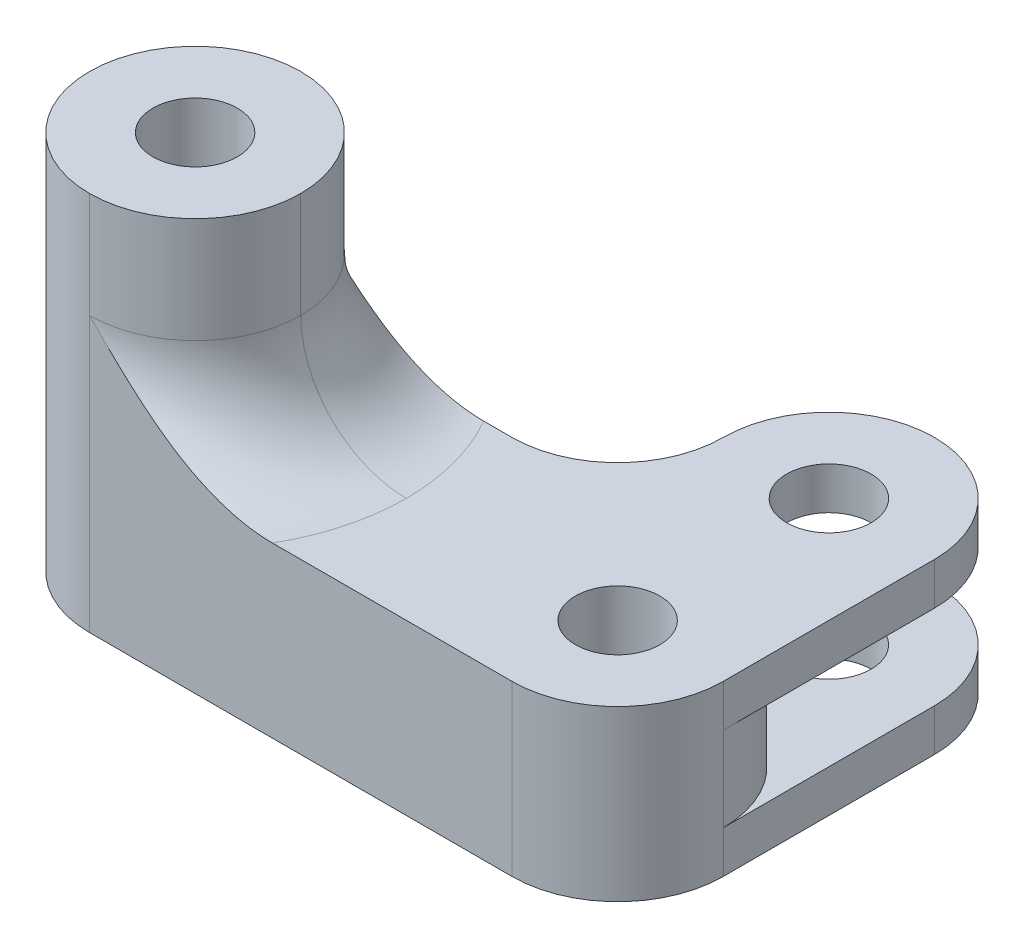
ISO-10303-21;
HEADER;
FILE_DESCRIPTION(('STEP AP214'),'2;1');
FILE_NAME('part.step','',(''),(''),'','','');
FILE_SCHEMA(('AUTOMOTIVE_DESIGN { 1 0 10303 214 1 1 1 1 }'));
ENDSEC;
DATA;
#1=APPLICATION_CONTEXT('core data for automotive mechanical design processes');
#2=APPLICATION_PROTOCOL_DEFINITION('international standard','automotive_design',2000,#1);
#3=PRODUCT_CONTEXT('',#1,'mechanical');
#4=PRODUCT('Part','Part','',(#3));
#5=PRODUCT_RELATED_PRODUCT_CATEGORY('part','',(#4));
#6=PRODUCT_DEFINITION_FORMATION('','',#4);
#7=PRODUCT_DEFINITION_CONTEXT('part definition',#1,'design');
#8=PRODUCT_DEFINITION('design','',#6,#7);
#9=PRODUCT_DEFINITION_SHAPE('','',#8);
#10=(LENGTH_UNIT() NAMED_UNIT(*) SI_UNIT(.MILLI.,.METRE.));
#11=(NAMED_UNIT(*) PLANE_ANGLE_UNIT() SI_UNIT($,.RADIAN.));
#12=(NAMED_UNIT(*) SI_UNIT($,.STERADIAN.) SOLID_ANGLE_UNIT());
#13=UNCERTAINTY_MEASURE_WITH_UNIT(LENGTH_MEASURE(1.E-05),#10,'distance_accuracy_value','');
#14=(GEOMETRIC_REPRESENTATION_CONTEXT(3) GLOBAL_UNCERTAINTY_ASSIGNED_CONTEXT((#13)) GLOBAL_UNIT_ASSIGNED_CONTEXT((#10,
#11,#12)) REPRESENTATION_CONTEXT('',''));
#15=CARTESIAN_POINT('',(0.,0.,0.));
#16=DIRECTION('',(0.,0.,1.));
#17=DIRECTION('',(1.,0.,0.));
#18=AXIS2_PLACEMENT_3D('',#15,#16,#17);
#19=CARTESIAN_POINT('',(-20.,4.,0.));
#20=DIRECTION('',(-1.,0.,0.));
#21=DIRECTION('',(0.,0.,-1.));
#22=AXIS2_PLACEMENT_3D('',#19,#20,#21);
#23=PLANE('',#22);
#24=DIRECTION('',(0.,-1.,0.));
#25=VECTOR('',#24,1.);
#26=CARTESIAN_POINT('',(-20.,4.,-2.5));
#27=LINE('',#26,#25);
#28=CARTESIAN_POINT('',(-20.,0.,-2.5));
#29=VERTEX_POINT('',#28);
#30=CARTESIAN_POINT('',(-20.,1.,-2.5));
#31=VERTEX_POINT('',#30);
#32=EDGE_CURVE('E278',#29,#31,#27,.F.);
#33=ORIENTED_EDGE('',*,*,#32,.F.);
#34=DIRECTION('',(0.,0.,1.));
#35=VECTOR('',#34,1.);
#36=CARTESIAN_POINT('',(-20.,0.,0.));
#37=LINE('',#36,#35);
#38=CARTESIAN_POINT('',(-20.,0.,-7.5));
#39=VERTEX_POINT('',#38);
#40=EDGE_CURVE('E184',#39,#29,#37,.T.);
#41=ORIENTED_EDGE('',*,*,#40,.F.);
#42=DIRECTION('',(0.,-1.,0.));
#43=VECTOR('',#42,1.);
#44=CARTESIAN_POINT('',(-20.,4.,-7.5));
#45=LINE('',#44,#43);
#46=CARTESIAN_POINT('',(-20.,1.,-7.5));
#47=VERTEX_POINT('',#46);
#48=EDGE_CURVE('E267',#47,#39,#45,.T.);
#49=ORIENTED_EDGE('',*,*,#48,.F.);
#50=DIRECTION('',(0.,0.,-1.));
#51=VECTOR('',#50,1.);
#52=CARTESIAN_POINT('',(-20.,1.,-5.));
#53=LINE('',#52,#51);
#54=EDGE_CURVE('E472',#31,#47,#53,.T.);
#55=ORIENTED_EDGE('',*,*,#54,.F.);
#56=EDGE_LOOP('',(#33,#41,#49,#55));
#57=FACE_BOUND('',#56,.T.);
#58=ADVANCED_FACE('F44',(#57),#23,.F.);
#59=CARTESIAN_POINT('',(-22.5,0.,-7.5));
#60=DIRECTION('',(0.,1.,0.));
#61=DIRECTION('',(0.,0.,1.));
#62=AXIS2_PLACEMENT_3D('',#59,#60,#61);
#63=CYLINDRICAL_SURFACE('',#62,1.);
#64=CARTESIAN_POINT('',(-22.5,3.,-7.5));
#65=DIRECTION('',(0.,-1.,0.));
#66=DIRECTION('',(0.,0.,1.));
#67=AXIS2_PLACEMENT_3D('',#64,#65,#66);
#68=CIRCLE('',#67,1.);
#69=CARTESIAN_POINT('',(-22.5,3.,-6.5));
#70=VERTEX_POINT('',#69);
#71=EDGE_CURVE('E228',#70,#70,#68,.F.);
#72=ORIENTED_EDGE('',*,*,#71,.F.);
#73=EDGE_LOOP('',(#72));
#74=FACE_BOUND('',#73,.T.);
#75=CARTESIAN_POINT('',(-22.5,4.,-7.5));
#76=DIRECTION('',(0.,-1.,0.));
#77=DIRECTION('',(0.,0.,1.));
#78=AXIS2_PLACEMENT_3D('',#75,#76,#77);
#79=CIRCLE('',#78,1.);
#80=CARTESIAN_POINT('',(-22.5,4.,-6.5));
#81=VERTEX_POINT('',#80);
#82=EDGE_CURVE('E216',#81,#81,#79,.T.);
#83=ORIENTED_EDGE('',*,*,#82,.F.);
#84=EDGE_LOOP('',(#83));
#85=FACE_BOUND('',#84,.T.);
#86=ADVANCED_FACE('F444',(#74,#85),#63,.F.);
#87=CARTESIAN_POINT('',(-20.,4.,0.));
#88=DIRECTION('',(0.,-1.,0.));
#89=DIRECTION('',(0.,0.,-1.));
#90=AXIS2_PLACEMENT_3D('',#87,#88,#89);
#91=PLANE('',#90);
#92=CARTESIAN_POINT('',(-22.5,4.,-2.5));
#93=DIRECTION('',(0.,-1.,0.));
#94=DIRECTION('',(0.,0.,1.));
#95=AXIS2_PLACEMENT_3D('',#92,#93,#94);
#96=CIRCLE('',#95,1.);
#97=CARTESIAN_POINT('',(-22.5,4.,-1.5));
#98=VERTEX_POINT('',#97);
#99=EDGE_CURVE('E488',#98,#98,#96,.T.);
#100=ORIENTED_EDGE('',*,*,#99,.T.);
#101=EDGE_LOOP('',(#100));
#102=FACE_BOUND('',#101,.T.);
#103=ORIENTED_EDGE('',*,*,#82,.T.);
#104=EDGE_LOOP('',(#103));
#105=FACE_BOUND('',#104,.T.);
#106=DIRECTION('',(-1.,0.,0.));
#107=VECTOR('',#106,1.);
#108=CARTESIAN_POINT('',(-35.,4.,0.));
#109=LINE('',#108,#107);
#110=CARTESIAN_POINT('',(-22.5,4.,0.));
#111=VERTEX_POINT('',#110);
#112=CARTESIAN_POINT('',(-28.1698729810779,4.,0.));
#113=VERTEX_POINT('',#112);
#114=EDGE_CURVE('E223',#111,#113,#109,.T.);
#115=ORIENTED_EDGE('',*,*,#114,.F.);
#116=CARTESIAN_POINT('',(-22.5,4.,-2.5));
#117=DIRECTION('',(0.,1.,0.));
#118=DIRECTION('',(0.,0.,-1.));
#119=AXIS2_PLACEMENT_3D('',#116,#117,#118);
#120=CIRCLE('',#119,2.5);
#121=CARTESIAN_POINT('',(-20.,4.,-2.5));
#122=VERTEX_POINT('',#121);
#123=EDGE_CURVE('E196',#122,#111,#120,.F.);
#124=ORIENTED_EDGE('',*,*,#123,.F.);
#125=DIRECTION('',(0.,0.,1.));
#126=VECTOR('',#125,1.);
#127=CARTESIAN_POINT('',(-20.,4.,0.));
#128=LINE('',#127,#126);
#129=CARTESIAN_POINT('',(-20.,4.,-7.5));
#130=VERTEX_POINT('',#129);
#131=EDGE_CURVE('E202',#130,#122,#128,.T.);
#132=ORIENTED_EDGE('',*,*,#131,.F.);
#133=CARTESIAN_POINT('',(-22.5,4.,-7.5));
#134=DIRECTION('',(0.,1.,0.));
#135=DIRECTION('',(0.,0.,-1.));
#136=AXIS2_PLACEMENT_3D('',#133,#134,#135);
#137=CIRCLE('',#136,2.5);
#138=CARTESIAN_POINT('',(-22.5,4.,-10.));
#139=VERTEX_POINT('',#138);
#140=EDGE_CURVE('E298',#139,#130,#137,.F.);
#141=ORIENTED_EDGE('',*,*,#140,.F.);
#142=CARTESIAN_POINT('',(-22.5,4.,-7.5));
#143=DIRECTION('',(0.,1.,0.));
#144=DIRECTION('',(0.,0.,-1.));
#145=AXIS2_PLACEMENT_3D('',#142,#143,#144);
#146=CIRCLE('',#145,2.5);
#147=CARTESIAN_POINT('',(-25.,4.,-7.5));
#148=VERTEX_POINT('',#147);
#149=EDGE_CURVE('E189',#148,#139,#146,.F.);
#150=ORIENTED_EDGE('',*,*,#149,.F.);
#151=CARTESIAN_POINT('',(-27.5,4.,-7.5));
#152=DIRECTION('',(0.,1.,0.));
#153=DIRECTION('',(0.,0.,-1.));
#154=AXIS2_PLACEMENT_3D('',#151,#152,#153);
#155=CIRCLE('',#154,2.5);
#156=CARTESIAN_POINT('',(-27.5,4.,-5.));
#157=VERTEX_POINT('',#156);
#158=EDGE_CURVE('E336',#157,#148,#155,.T.);
#159=ORIENTED_EDGE('',*,*,#158,.F.);
#160=DIRECTION('',(1.,0.,0.));
#161=VECTOR('',#160,1.);
#162=CARTESIAN_POINT('',(-25.,4.,-5.));
#163=LINE('',#162,#161);
#164=CARTESIAN_POINT('',(-28.1698729810779,4.,-5.));
#165=VERTEX_POINT('',#164);
#166=EDGE_CURVE('E500',#165,#157,#163,.T.);
#167=ORIENTED_EDGE('',*,*,#166,.F.);
#168=CARTESIAN_POINT('',(-32.5000000000001,4.,-2.5));
#169=DIRECTION('',(0.,1.,0.));
#170=DIRECTION('',(0.,0.,-1.));
#171=AXIS2_PLACEMENT_3D('',#168,#169,#170);
#172=CIRCLE('',#171,5.);
#173=CARTESIAN_POINT('',(-27.5000000000001,4.,-2.5));
#174=VERTEX_POINT('',#173);
#175=EDGE_CURVE('E340',#174,#165,#172,.T.);
#176=ORIENTED_EDGE('',*,*,#175,.F.);
#177=CARTESIAN_POINT('',(-32.5000000000001,4.,-2.5));
#178=DIRECTION('',(0.,1.,0.));
#179=DIRECTION('',(0.,0.,-1.));
#180=AXIS2_PLACEMENT_3D('',#177,#178,#179);
#181=CIRCLE('',#180,5.);
#182=EDGE_CURVE('E372',#113,#174,#181,.T.);
#183=ORIENTED_EDGE('',*,*,#182,.F.);
#184=EDGE_LOOP('',(#115,#124,#132,#141,#150,#159,#167,#176,#183));
#185=FACE_BOUND('',#184,.T.);
#186=ADVANCED_FACE('F451',(#102,#105,#185),#91,.F.);
#187=CARTESIAN_POINT('',(-35.,4.,0.));
#188=DIRECTION('',(0.,0.,-1.));
#189=DIRECTION('',(1.,0.,0.));
#190=AXIS2_PLACEMENT_3D('',#187,#188,#189);
#191=PLANE('',#190);
#192=DIRECTION('',(0.,-1.,0.));
#193=VECTOR('',#192,1.);
#194=CARTESIAN_POINT('',(-32.5,4.,0.));
#195=LINE('',#194,#193);
#196=CARTESIAN_POINT('',(-32.5,0.,0.));
#197=VERTEX_POINT('',#196);
#198=CARTESIAN_POINT('',(-32.5,6.5,0.));
#199=VERTEX_POINT('',#198);
#200=EDGE_CURVE('E201',#197,#199,#195,.F.);
#201=ORIENTED_EDGE('',*,*,#200,.F.);
#202=DIRECTION('',(-1.,0.,0.));
#203=VECTOR('',#202,1.);
#204=CARTESIAN_POINT('',(-35.,0.,0.));
#205=LINE('',#204,#203);
#206=CARTESIAN_POINT('',(-22.5,0.,0.));
#207=VERTEX_POINT('',#206);
#208=EDGE_CURVE('E181',#207,#197,#205,.T.);
#209=ORIENTED_EDGE('',*,*,#208,.F.);
#210=DIRECTION('',(0.,-1.,0.));
#211=VECTOR('',#210,1.);
#212=CARTESIAN_POINT('',(-22.5,4.,0.));
#213=LINE('',#212,#211);
#214=EDGE_CURVE('E193',#111,#207,#213,.T.);
#215=ORIENTED_EDGE('',*,*,#214,.F.);
#216=ORIENTED_EDGE('',*,*,#114,.T.);
#217=CARTESIAN_POINT('',(-28.1698729810779,4.,0.));
#218=CARTESIAN_POINT('',(-28.2769921376524,3.99998518822628,0.));
#219=CARTESIAN_POINT('',(-28.3840486962264,4.00516117568163,0.));
#220=CARTESIAN_POINT('',(-28.5970987602378,4.02518383038269,0.));
#221=CARTESIAN_POINT('',(-28.7030936345857,4.04001578081046,0.));
#222=CARTESIAN_POINT('',(-28.9121461196993,4.07841097755199,0.));
#223=CARTESIAN_POINT('',(-29.0152237325047,4.10186688814086,0.));
#224=CARTESIAN_POINT('',(-29.2192513301736,4.15679854268729,0.));
#225=CARTESIAN_POINT('',(-29.3202002736822,4.18827811762926,0.));
#226=CARTESIAN_POINT('',(-29.5565843663964,4.27155881264309,0.));
#227=CARTESIAN_POINT('',(-29.690894775336,4.32656450342293,0.));
#228=CARTESIAN_POINT('',(-29.954133986294,4.44830711980283,0.));
#229=CARTESIAN_POINT('',(-30.0830583811297,4.51505342834353,0.));
#230=CARTESIAN_POINT('',(-30.4625016172661,4.73067190225552,0.));
#231=CARTESIAN_POINT('',(-30.7045392055099,4.89448830853526,0.));
#232=CARTESIAN_POINT('',(-31.2165518580897,5.28416937733513,0.));
#233=CARTESIAN_POINT('',(-31.4819025558838,5.51585571962648,0.));
#234=CARTESIAN_POINT('',(-31.9958369049189,5.99599504758527,0.));
#235=CARTESIAN_POINT('',(-32.2444334034416,6.24443488717616,0.));
#236=CARTESIAN_POINT('',(-32.4952859568564,6.49528595699774,0.));
#237=CARTESIAN_POINT('',(-32.4976429794846,6.49764297964821,0.));
#238=CARTESIAN_POINT('',(-32.5000000000001,6.5,0.));
#239=B_SPLINE_CURVE_WITH_KNOTS('',3,(#217,#218,#219,#220,#221,#222,#223,#224,#225,#226,#227,
#228,#229,#230,#231,#232,#233,#234,#235,#236,#237,#238),.UNSPECIFIED.,.F.,.F.,(4,2,2,2,2,2,2,2,
2,2,4),(0.,0.321140775587337,0.641793237301768,0.958582896209301,1.27552409399564,
1.71024159436257,2.1453081066917,3.0190883706329,4.07417999061932,5.12845312778747,
5.13845312779328),.UNSPECIFIED.);
#240=EDGE_CURVE('E55',#199,#113,#239,.F.);
#241=ORIENTED_EDGE('',*,*,#240,.F.);
#242=EDGE_LOOP('',(#201,#209,#215,#216,#241));
#243=FACE_BOUND('',#242,.T.);
#244=ADVANCED_FACE('F204',(#243),#191,.F.);
#245=CARTESIAN_POINT('',(-25.,4.,-5.));
#246=DIRECTION('',(0.,0.,1.));
#247=DIRECTION('',(-1.,0.,0.));
#248=AXIS2_PLACEMENT_3D('',#245,#246,#247);
#249=PLANE('',#248);
#250=DIRECTION('',(1.,0.,0.));
#251=VECTOR('',#250,1.);
#252=CARTESIAN_POINT('',(-20.,1.,-5.));
#253=LINE('',#252,#251);
#254=CARTESIAN_POINT('',(-27.5,1.,-5.));
#255=VERTEX_POINT('',#254);
#256=CARTESIAN_POINT('',(-22.5,1.,-5.));
#257=VERTEX_POINT('',#256);
#258=EDGE_CURVE('E354',#255,#257,#253,.T.);
#259=ORIENTED_EDGE('',*,*,#258,.F.);
#260=DIRECTION('',(0.,-1.,0.));
#261=VECTOR('',#260,1.);
#262=CARTESIAN_POINT('',(-27.5,1.,-5.));
#263=LINE('',#262,#261);
#264=CARTESIAN_POINT('',(-27.5,0.,-5.));
#265=VERTEX_POINT('',#264);
#266=EDGE_CURVE('E259',#265,#255,#263,.F.);
#267=ORIENTED_EDGE('',*,*,#266,.F.);
#268=DIRECTION('',(1.,0.,0.));
#269=VECTOR('',#268,1.);
#270=CARTESIAN_POINT('',(-25.,0.,-5.));
#271=LINE('',#270,#269);
#272=CARTESIAN_POINT('',(-32.5,0.,-5.));
#273=VERTEX_POINT('',#272);
#274=EDGE_CURVE('E208',#273,#265,#271,.T.);
#275=ORIENTED_EDGE('',*,*,#274,.F.);
#276=DIRECTION('',(0.,-1.,0.));
#277=VECTOR('',#276,1.);
#278=CARTESIAN_POINT('',(-32.5,4.,-5.));
#279=LINE('',#278,#277);
#280=CARTESIAN_POINT('',(-32.5,6.5,-5.));
#281=VERTEX_POINT('',#280);
#282=EDGE_CURVE('E252',#281,#273,#279,.T.);
#283=ORIENTED_EDGE('',*,*,#282,.F.);
#284=CARTESIAN_POINT('',(-28.1698729810779,4.,-5.));
#285=CARTESIAN_POINT('',(-28.2769921376524,3.99998518822628,-5.));
#286=CARTESIAN_POINT('',(-28.3840486962264,4.00516117568163,-5.));
#287=CARTESIAN_POINT('',(-28.5970987602378,4.02518383038269,-5.));
#288=CARTESIAN_POINT('',(-28.7030936345857,4.04001578081046,-5.));
#289=CARTESIAN_POINT('',(-28.9121461196993,4.07841097755199,-5.));
#290=CARTESIAN_POINT('',(-29.0152237325047,4.10186688814086,-5.));
#291=CARTESIAN_POINT('',(-29.2192513301736,4.15679854268729,-5.));
#292=CARTESIAN_POINT('',(-29.3202002736822,4.18827811762926,-5.));
#293=CARTESIAN_POINT('',(-29.5565843663964,4.27155881264309,-5.));
#294=CARTESIAN_POINT('',(-29.690894775336,4.32656450342293,-5.));
#295=CARTESIAN_POINT('',(-29.954133986294,4.44830711980283,-5.));
#296=CARTESIAN_POINT('',(-30.0830583811297,4.51505342834353,-5.));
#297=CARTESIAN_POINT('',(-30.4625016172661,4.73067190225552,-5.));
#298=CARTESIAN_POINT('',(-30.7045392055099,4.89448830853526,-5.));
#299=CARTESIAN_POINT('',(-31.2165518580897,5.28416937733513,-5.));
#300=CARTESIAN_POINT('',(-31.4819025558838,5.51585571962648,-5.));
#301=CARTESIAN_POINT('',(-31.9958369049189,5.99599504758527,-5.));
#302=CARTESIAN_POINT('',(-32.2444334034416,6.24443488717616,-5.));
#303=CARTESIAN_POINT('',(-32.4952859568564,6.49528595699774,-5.));
#304=CARTESIAN_POINT('',(-32.4976429794846,6.49764297964821,-5.));
#305=CARTESIAN_POINT('',(-32.5000000000001,6.5,-5.));
#306=B_SPLINE_CURVE_WITH_KNOTS('',3,(#284,#285,#286,#287,#288,#289,#290,#291,#292,#293,#294,
#295,#296,#297,#298,#299,#300,#301,#302,#303,#304,#305),.UNSPECIFIED.,.F.,.F.,(4,2,2,2,2,2,2,2,
2,2,4),(0.,0.321140775587337,0.641793237301768,0.958582896209301,1.27552409399564,
1.71024159436257,2.1453081066917,3.0190883706329,4.07417999061932,5.12845312778747,
5.13845312779328),.UNSPECIFIED.);
#307=EDGE_CURVE('E11',#165,#281,#306,.T.);
#308=ORIENTED_EDGE('',*,*,#307,.F.);
#309=ORIENTED_EDGE('',*,*,#166,.T.);
#310=DIRECTION('',(0.,-1.,0.));
#311=VECTOR('',#310,1.);
#312=CARTESIAN_POINT('',(-27.5,4.,-5.));
#313=LINE('',#312,#311);
#314=CARTESIAN_POINT('',(-27.5,3.,-5.));
#315=VERTEX_POINT('',#314);
#316=EDGE_CURVE('E256',#315,#157,#313,.F.);
#317=ORIENTED_EDGE('',*,*,#316,.F.);
#318=DIRECTION('',(-1.,0.,0.));
#319=VECTOR('',#318,1.);
#320=CARTESIAN_POINT('',(-20.,3.,-5.));
#321=LINE('',#320,#319);
#322=CARTESIAN_POINT('',(-22.5,3.,-5.));
#323=VERTEX_POINT('',#322);
#324=EDGE_CURVE('E476',#323,#315,#321,.T.);
#325=ORIENTED_EDGE('',*,*,#324,.F.);
#326=DIRECTION('',(0.,1.,0.));
#327=VECTOR('',#326,1.);
#328=CARTESIAN_POINT('',(-22.5,4.,-5.));
#329=LINE('',#328,#327);
#330=EDGE_CURVE('E263',#257,#323,#329,.T.);
#331=ORIENTED_EDGE('',*,*,#330,.F.);
#332=EDGE_LOOP('',(#259,#267,#275,#283,#308,#309,#317,#325,#331));
#333=FACE_BOUND('',#332,.T.);
#334=ADVANCED_FACE('F457',(#333),#249,.F.);
#335=DIRECTION('',(0.,0.,-1.));
#336=VECTOR('',#335,1.);
#337=CARTESIAN_POINT('',(-20.,3.,-5.));
#338=LINE('',#337,#336);
#339=CARTESIAN_POINT('',(-20.,3.,-2.5));
#340=VERTEX_POINT('',#339);
#341=CARTESIAN_POINT('',(-20.,3.,-7.5));
#342=VERTEX_POINT('',#341);
#343=EDGE_CURVE('E229',#340,#342,#338,.T.);
#344=ORIENTED_EDGE('',*,*,#343,.T.);
#345=DIRECTION('',(0.,-1.,0.));
#346=VECTOR('',#345,1.);
#347=CARTESIAN_POINT('',(-20.,4.,-7.5));
#348=LINE('',#347,#346);
#349=EDGE_CURVE('E271',#130,#342,#348,.T.);
#350=ORIENTED_EDGE('',*,*,#349,.F.);
#351=ORIENTED_EDGE('',*,*,#131,.T.);
#352=DIRECTION('',(0.,-1.,0.));
#353=VECTOR('',#352,1.);
#354=CARTESIAN_POINT('',(-20.,4.,-2.5));
#355=LINE('',#354,#353);
#356=EDGE_CURVE('E275',#340,#122,#355,.F.);
#357=ORIENTED_EDGE('',*,*,#356,.F.);
#358=EDGE_LOOP('',(#344,#350,#351,#357));
#359=FACE_BOUND('',#358,.T.);
#360=ADVANCED_FACE('F447',(#359),#23,.F.);
#361=CARTESIAN_POINT('',(-20.,0.,0.));
#362=DIRECTION('',(0.,-1.,0.));
#363=DIRECTION('',(0.,0.,-1.));
#364=AXIS2_PLACEMENT_3D('',#361,#362,#363);
#365=PLANE('',#364);
#366=CARTESIAN_POINT('',(-22.5,0.,-7.5));
#367=DIRECTION('',(0.,-1.,0.));
#368=DIRECTION('',(0.,0.,1.));
#369=AXIS2_PLACEMENT_3D('',#366,#367,#368);
#370=CIRCLE('',#369,1.);
#371=CARTESIAN_POINT('',(-22.5,0.,-6.5));
#372=VERTEX_POINT('',#371);
#373=EDGE_CURVE('E209',#372,#372,#370,.T.);
#374=ORIENTED_EDGE('',*,*,#373,.F.);
#375=EDGE_LOOP('',(#374));
#376=FACE_BOUND('',#375,.T.);
#377=CARTESIAN_POINT('',(-22.5,0.,-2.5));
#378=DIRECTION('',(0.,-1.,0.));
#379=DIRECTION('',(0.,0.,1.));
#380=AXIS2_PLACEMENT_3D('',#377,#378,#379);
#381=CIRCLE('',#380,1.);
#382=CARTESIAN_POINT('',(-22.5,0.,-1.5));
#383=VERTEX_POINT('',#382);
#384=EDGE_CURVE('E492',#383,#383,#381,.T.);
#385=ORIENTED_EDGE('',*,*,#384,.F.);
#386=EDGE_LOOP('',(#385));
#387=FACE_BOUND('',#386,.T.);
#388=CARTESIAN_POINT('',(-32.5,0.,-2.5));
#389=DIRECTION('',(0.,-1.,0.));
#390=DIRECTION('',(0.,0.,1.));
#391=AXIS2_PLACEMENT_3D('',#388,#389,#390);
#392=CIRCLE('',#391,1.);
#393=CARTESIAN_POINT('',(-32.5,0.,-1.5));
#394=VERTEX_POINT('',#393);
#395=EDGE_CURVE('E483',#394,#394,#392,.T.);
#396=ORIENTED_EDGE('',*,*,#395,.F.);
#397=EDGE_LOOP('',(#396));
#398=FACE_BOUND('',#397,.T.);
#399=ORIENTED_EDGE('',*,*,#208,.T.);
#400=CARTESIAN_POINT('',(-32.5,0.,-2.5));
#401=DIRECTION('',(0.,1.,0.));
#402=DIRECTION('',(0.,0.,-1.));
#403=AXIS2_PLACEMENT_3D('',#400,#401,#402);
#404=CIRCLE('',#403,2.5);
#405=CARTESIAN_POINT('',(-35.,0.,-2.5));
#406=VERTEX_POINT('',#405);
#407=EDGE_CURVE('E285',#406,#197,#404,.T.);
#408=ORIENTED_EDGE('',*,*,#407,.F.);
#409=CARTESIAN_POINT('',(-32.5,0.,-2.5));
#410=DIRECTION('',(0.,1.,0.));
#411=DIRECTION('',(0.,0.,-1.));
#412=AXIS2_PLACEMENT_3D('',#409,#410,#411);
#413=CIRCLE('',#412,2.5);
#414=EDGE_CURVE('E281',#273,#406,#413,.T.);
#415=ORIENTED_EDGE('',*,*,#414,.F.);
#416=ORIENTED_EDGE('',*,*,#274,.T.);
#417=CARTESIAN_POINT('',(-27.5,0.,-7.5));
#418=DIRECTION('',(0.,1.,0.));
#419=DIRECTION('',(0.,0.,-1.));
#420=AXIS2_PLACEMENT_3D('',#417,#418,#419);
#421=CIRCLE('',#420,2.5);
#422=CARTESIAN_POINT('',(-25.,0.,-7.5));
#423=VERTEX_POINT('',#422);
#424=EDGE_CURVE('E326',#423,#265,#421,.F.);
#425=ORIENTED_EDGE('',*,*,#424,.F.);
#426=CARTESIAN_POINT('',(-22.5,0.,-7.5));
#427=DIRECTION('',(0.,1.,0.));
#428=DIRECTION('',(0.,0.,-1.));
#429=AXIS2_PLACEMENT_3D('',#426,#427,#428);
#430=CIRCLE('',#429,2.5);
#431=CARTESIAN_POINT('',(-22.5,0.,-10.));
#432=VERTEX_POINT('',#431);
#433=EDGE_CURVE('E288',#432,#423,#430,.T.);
#434=ORIENTED_EDGE('',*,*,#433,.F.);
#435=CARTESIAN_POINT('',(-22.5,0.,-7.5));
#436=DIRECTION('',(0.,1.,0.));
#437=DIRECTION('',(0.,0.,-1.));
#438=AXIS2_PLACEMENT_3D('',#435,#436,#437);
#439=CIRCLE('',#438,2.5);
#440=EDGE_CURVE('E190',#39,#432,#439,.T.);
#441=ORIENTED_EDGE('',*,*,#440,.F.);
#442=ORIENTED_EDGE('',*,*,#40,.T.);
#443=CARTESIAN_POINT('',(-22.5,0.,-2.5));
#444=DIRECTION('',(0.,1.,0.));
#445=DIRECTION('',(0.,0.,-1.));
#446=AXIS2_PLACEMENT_3D('',#443,#444,#445);
#447=CIRCLE('',#446,2.5);
#448=EDGE_CURVE('E176',#207,#29,#447,.T.);
#449=ORIENTED_EDGE('',*,*,#448,.F.);
#450=EDGE_LOOP('',(#399,#408,#415,#416,#425,#434,#441,#442,#449));
#451=FACE_BOUND('',#450,.T.);
#452=ADVANCED_FACE('F178',(#376,#387,#398,#451),#365,.T.);
#453=CARTESIAN_POINT('',(-32.5,0.,-2.5));
#454=DIRECTION('',(0.,1.,0.));
#455=DIRECTION('',(0.,0.,1.));
#456=AXIS2_PLACEMENT_3D('',#453,#454,#455);
#457=CYLINDRICAL_SURFACE('',#456,1.);
#458=ORIENTED_EDGE('',*,*,#395,.T.);
#459=EDGE_LOOP('',(#458));
#460=FACE_BOUND('',#459,.T.);
#461=CARTESIAN_POINT('',(-32.5,9.,-2.5));
#462=DIRECTION('',(0.,-1.,0.));
#463=DIRECTION('',(0.,0.,1.));
#464=AXIS2_PLACEMENT_3D('',#461,#462,#463);
#465=CIRCLE('',#464,1.);
#466=CARTESIAN_POINT('',(-32.5,9.,-1.5));
#467=VERTEX_POINT('',#466);
#468=EDGE_CURVE('E232',#467,#467,#465,.T.);
#469=ORIENTED_EDGE('',*,*,#468,.F.);
#470=EDGE_LOOP('',(#469));
#471=FACE_BOUND('',#470,.T.);
#472=ADVANCED_FACE('F463',(#460,#471),#457,.F.);
#473=CARTESIAN_POINT('',(-22.5,0.,-2.5));
#474=DIRECTION('',(0.,1.,0.));
#475=DIRECTION('',(0.,0.,1.));
#476=AXIS2_PLACEMENT_3D('',#473,#474,#475);
#477=CYLINDRICAL_SURFACE('',#476,1.);
#478=ORIENTED_EDGE('',*,*,#384,.T.);
#479=EDGE_LOOP('',(#478));
#480=FACE_BOUND('',#479,.T.);
#481=ORIENTED_EDGE('',*,*,#99,.F.);
#482=EDGE_LOOP('',(#481));
#483=FACE_BOUND('',#482,.T.);
#484=ADVANCED_FACE('F545',(#480,#483),#477,.F.);
#485=CARTESIAN_POINT('',(-22.5,1.,-7.5));
#486=DIRECTION('',(0.,1.,0.));
#487=DIRECTION('',(0.,0.,-1.));
#488=AXIS2_PLACEMENT_3D('',#485,#486,#487);
#489=CIRCLE('',#488,1.);
#490=CARTESIAN_POINT('',(-22.5,1.,-8.5));
#491=VERTEX_POINT('',#490);
#492=EDGE_CURVE('E224',#491,#491,#489,.F.);
#493=ORIENTED_EDGE('',*,*,#492,.F.);
#494=EDGE_LOOP('',(#493));
#495=FACE_BOUND('',#494,.T.);
#496=ORIENTED_EDGE('',*,*,#373,.T.);
#497=EDGE_LOOP('',(#496));
#498=FACE_BOUND('',#497,.T.);
#499=ADVANCED_FACE('F454',(#495,#498),#63,.F.);
#500=CARTESIAN_POINT('',(-20.,9.,0.));
#501=DIRECTION('',(0.,1.,0.));
#502=DIRECTION('',(0.,0.,1.));
#503=AXIS2_PLACEMENT_3D('',#500,#501,#502);
#504=PLANE('',#503);
#505=CARTESIAN_POINT('',(-32.5000000000001,9.,-2.5));
#506=DIRECTION('',(0.,-1.,0.));
#507=DIRECTION('',(0.,0.,1.));
#508=AXIS2_PLACEMENT_3D('',#505,#506,#507);
#509=CIRCLE('',#508,2.5);
#510=CARTESIAN_POINT('',(-32.5,9.,-5.));
#511=VERTEX_POINT('',#510);
#512=CARTESIAN_POINT('',(-30.0000000000001,9.,-2.5));
#513=VERTEX_POINT('',#512);
#514=EDGE_CURVE('E240',#511,#513,#509,.T.);
#515=ORIENTED_EDGE('',*,*,#514,.F.);
#516=CARTESIAN_POINT('',(-32.5,9.,-2.5));
#517=DIRECTION('',(0.,-1.,0.));
#518=DIRECTION('',(0.,0.,1.));
#519=AXIS2_PLACEMENT_3D('',#516,#517,#518);
#520=CIRCLE('',#519,2.5);
#521=CARTESIAN_POINT('',(-35.,9.,-2.5));
#522=VERTEX_POINT('',#521);
#523=EDGE_CURVE('E236',#522,#511,#520,.T.);
#524=ORIENTED_EDGE('',*,*,#523,.F.);
#525=CARTESIAN_POINT('',(-32.5,9.,-2.5));
#526=DIRECTION('',(0.,-1.,0.));
#527=DIRECTION('',(0.,0.,1.));
#528=AXIS2_PLACEMENT_3D('',#525,#526,#527);
#529=CIRCLE('',#528,2.5);
#530=CARTESIAN_POINT('',(-32.5,9.,0.));
#531=VERTEX_POINT('',#530);
#532=EDGE_CURVE('E244',#531,#522,#529,.T.);
#533=ORIENTED_EDGE('',*,*,#532,.F.);
#534=CARTESIAN_POINT('',(-32.5000000000001,9.,-2.5));
#535=DIRECTION('',(0.,-1.,0.));
#536=DIRECTION('',(0.,0.,1.));
#537=AXIS2_PLACEMENT_3D('',#534,#535,#536);
#538=CIRCLE('',#537,2.5);
#539=EDGE_CURVE('E248',#513,#531,#538,.T.);
#540=ORIENTED_EDGE('',*,*,#539,.F.);
#541=EDGE_LOOP('',(#515,#524,#533,#540));
#542=FACE_BOUND('',#541,.T.);
#543=ORIENTED_EDGE('',*,*,#468,.T.);
#544=EDGE_LOOP('',(#543));
#545=FACE_BOUND('',#544,.T.);
#546=ADVANCED_FACE('F544',(#542,#545),#504,.T.);
#547=CARTESIAN_POINT('',(-20.,3.,-5.));
#548=DIRECTION('',(0.,1.,0.));
#549=DIRECTION('',(0.,0.,1.));
#550=AXIS2_PLACEMENT_3D('',#547,#548,#549);
#551=PLANE('',#550);
#552=ORIENTED_EDGE('',*,*,#343,.F.);
#553=CARTESIAN_POINT('',(-22.5,3.,-2.5));
#554=DIRECTION('',(0.,-1.,0.));
#555=DIRECTION('',(0.,0.,1.));
#556=AXIS2_PLACEMENT_3D('',#553,#554,#555);
#557=CIRCLE('',#556,2.5);
#558=EDGE_CURVE('E319',#323,#340,#557,.T.);
#559=ORIENTED_EDGE('',*,*,#558,.F.);
#560=ORIENTED_EDGE('',*,*,#324,.T.);
#561=CARTESIAN_POINT('',(-27.5,3.,-7.5));
#562=DIRECTION('',(0.,-1.,0.));
#563=DIRECTION('',(0.,0.,1.));
#564=AXIS2_PLACEMENT_3D('',#561,#562,#563);
#565=CIRCLE('',#564,2.5);
#566=CARTESIAN_POINT('',(-25.,3.,-7.5));
#567=VERTEX_POINT('',#566);
#568=EDGE_CURVE('E333',#567,#315,#565,.T.);
#569=ORIENTED_EDGE('',*,*,#568,.F.);
#570=CARTESIAN_POINT('',(-22.5,3.,-7.5));
#571=DIRECTION('',(0.,-1.,0.));
#572=DIRECTION('',(0.,0.,1.));
#573=AXIS2_PLACEMENT_3D('',#570,#571,#572);
#574=CIRCLE('',#573,2.5);
#575=CARTESIAN_POINT('',(-22.5,3.,-10.));
#576=VERTEX_POINT('',#575);
#577=EDGE_CURVE('E304',#576,#567,#574,.F.);
#578=ORIENTED_EDGE('',*,*,#577,.F.);
#579=CARTESIAN_POINT('',(-22.5,3.,-7.5));
#580=DIRECTION('',(0.,-1.,0.));
#581=DIRECTION('',(0.,0.,1.));
#582=AXIS2_PLACEMENT_3D('',#579,#580,#581);
#583=CIRCLE('',#582,2.5);
#584=EDGE_CURVE('E308',#342,#576,#583,.F.);
#585=ORIENTED_EDGE('',*,*,#584,.F.);
#586=EDGE_LOOP('',(#552,#559,#560,#569,#578,#585));
#587=FACE_BOUND('',#586,.T.);
#588=ORIENTED_EDGE('',*,*,#71,.T.);
#589=EDGE_LOOP('',(#588));
#590=FACE_BOUND('',#589,.T.);
#591=ADVANCED_FACE('F527',(#587,#590),#551,.F.);
#592=CARTESIAN_POINT('',(-20.,1.,-5.));
#593=DIRECTION('',(0.,-1.,0.));
#594=DIRECTION('',(0.,0.,-1.));
#595=AXIS2_PLACEMENT_3D('',#592,#593,#594);
#596=PLANE('',#595);
#597=CARTESIAN_POINT('',(-22.5,1.,-7.5));
#598=DIRECTION('',(0.,1.,0.));
#599=DIRECTION('',(0.,0.,-1.));
#600=AXIS2_PLACEMENT_3D('',#597,#598,#599);
#601=CIRCLE('',#600,2.5);
#602=CARTESIAN_POINT('',(-25.,1.,-7.5));
#603=VERTEX_POINT('',#602);
#604=CARTESIAN_POINT('',(-22.5,1.,-10.));
#605=VERTEX_POINT('',#604);
#606=EDGE_CURVE('E312',#603,#605,#601,.F.);
#607=ORIENTED_EDGE('',*,*,#606,.F.);
#608=CARTESIAN_POINT('',(-27.5,1.,-7.5));
#609=DIRECTION('',(0.,1.,0.));
#610=DIRECTION('',(0.,0.,-1.));
#611=AXIS2_PLACEMENT_3D('',#608,#609,#610);
#612=CIRCLE('',#611,2.5);
#613=EDGE_CURVE('E329',#255,#603,#612,.T.);
#614=ORIENTED_EDGE('',*,*,#613,.F.);
#615=ORIENTED_EDGE('',*,*,#258,.T.);
#616=CARTESIAN_POINT('',(-22.5,1.,-2.5));
#617=DIRECTION('',(0.,1.,0.));
#618=DIRECTION('',(0.,0.,-1.));
#619=AXIS2_PLACEMENT_3D('',#616,#617,#618);
#620=CIRCLE('',#619,2.5);
#621=EDGE_CURVE('E323',#31,#257,#620,.T.);
#622=ORIENTED_EDGE('',*,*,#621,.F.);
#623=ORIENTED_EDGE('',*,*,#54,.T.);
#624=CARTESIAN_POINT('',(-22.5,1.,-7.5));
#625=DIRECTION('',(0.,1.,0.));
#626=DIRECTION('',(0.,0.,-1.));
#627=AXIS2_PLACEMENT_3D('',#624,#625,#626);
#628=CIRCLE('',#627,2.5);
#629=EDGE_CURVE('E316',#605,#47,#628,.F.);
#630=ORIENTED_EDGE('',*,*,#629,.F.);
#631=EDGE_LOOP('',(#607,#614,#615,#622,#623,#630));
#632=FACE_BOUND('',#631,.T.);
#633=ORIENTED_EDGE('',*,*,#492,.T.);
#634=EDGE_LOOP('',(#633));
#635=FACE_BOUND('',#634,.T.);
#636=ADVANCED_FACE('F432',(#632,#635),#596,.F.);
#637=CARTESIAN_POINT('',(-32.5,4.,-2.5));
#638=DIRECTION('',(0.,-1.,0.));
#639=DIRECTION('',(0.,0.,-1.));
#640=AXIS2_PLACEMENT_3D('',#637,#638,#639);
#641=CYLINDRICAL_SURFACE('',#640,2.5);
#642=ORIENTED_EDGE('',*,*,#414,.T.);
#643=DIRECTION('',(0.,-1.,0.));
#644=VECTOR('',#643,1.);
#645=CARTESIAN_POINT('',(-35.,4.,-2.5));
#646=LINE('',#645,#644);
#647=EDGE_CURVE('E348',#406,#522,#646,.F.);
#648=ORIENTED_EDGE('',*,*,#647,.T.);
#649=ORIENTED_EDGE('',*,*,#523,.T.);
#650=DIRECTION('',(0.,-1.,0.));
#651=VECTOR('',#650,1.);
#652=CARTESIAN_POINT('',(-32.5,4.,-5.));
#653=LINE('',#652,#651);
#654=EDGE_CURVE('E351',#511,#281,#653,.T.);
#655=ORIENTED_EDGE('',*,*,#654,.T.);
#656=ORIENTED_EDGE('',*,*,#282,.T.);
#657=EDGE_LOOP('',(#642,#648,#649,#655,#656));
#658=FACE_BOUND('',#657,.T.);
#659=ADVANCED_FACE('F428',(#658),#641,.T.);
#660=CARTESIAN_POINT('',(-32.5000000000001,9.,-2.5));
#661=DIRECTION('',(0.,-1.,0.));
#662=DIRECTION('',(0.,0.,-1.));
#663=AXIS2_PLACEMENT_3D('',#660,#661,#662);
#664=CYLINDRICAL_SURFACE('',#663,2.5);
#665=ORIENTED_EDGE('',*,*,#654,.F.);
#666=ORIENTED_EDGE('',*,*,#514,.T.);
#667=DIRECTION('',(0.,-1.,0.));
#668=VECTOR('',#667,1.);
#669=CARTESIAN_POINT('',(-30.0000000000001,9.,-2.5));
#670=LINE('',#669,#668);
#671=CARTESIAN_POINT('',(-30.0000000000001,6.5,-2.5));
#672=VERTEX_POINT('',#671);
#673=EDGE_CURVE('E344',#513,#672,#670,.T.);
#674=ORIENTED_EDGE('',*,*,#673,.T.);
#675=CARTESIAN_POINT('',(-32.5000000000001,6.5,-2.5));
#676=DIRECTION('',(0.,1.,0.));
#677=DIRECTION('',(0.,0.,-1.));
#678=AXIS2_PLACEMENT_3D('',#675,#676,#677);
#679=CIRCLE('',#678,2.5);
#680=EDGE_CURVE('E62',#281,#672,#679,.F.);
#681=ORIENTED_EDGE('',*,*,#680,.F.);
#682=EDGE_LOOP('',(#665,#666,#674,#681));
#683=FACE_BOUND('',#682,.T.);
#684=ADVANCED_FACE('F431',(#683),#664,.T.);
#685=CARTESIAN_POINT('',(-32.5,4.,-2.5));
#686=DIRECTION('',(0.,-1.,0.));
#687=DIRECTION('',(0.,0.,-1.));
#688=AXIS2_PLACEMENT_3D('',#685,#686,#687);
#689=CYLINDRICAL_SURFACE('',#688,2.5);
#690=ORIENTED_EDGE('',*,*,#647,.F.);
#691=ORIENTED_EDGE('',*,*,#407,.T.);
#692=ORIENTED_EDGE('',*,*,#200,.T.);
#693=DIRECTION('',(0.,-1.,0.));
#694=VECTOR('',#693,1.);
#695=CARTESIAN_POINT('',(-32.5,4.,0.));
#696=LINE('',#695,#694);
#697=EDGE_CURVE('E341',#199,#531,#696,.F.);
#698=ORIENTED_EDGE('',*,*,#697,.T.);
#699=ORIENTED_EDGE('',*,*,#532,.T.);
#700=EDGE_LOOP('',(#690,#691,#692,#698,#699));
#701=FACE_BOUND('',#700,.T.);
#702=ADVANCED_FACE('F436',(#701),#689,.T.);
#703=CARTESIAN_POINT('',(-32.5000000000001,4.,-2.5));
#704=DIRECTION('',(0.,-1.,0.));
#705=DIRECTION('',(0.,0.,-1.));
#706=AXIS2_PLACEMENT_3D('',#703,#704,#705);
#707=CYLINDRICAL_SURFACE('',#706,2.5);
#708=ORIENTED_EDGE('',*,*,#673,.F.);
#709=ORIENTED_EDGE('',*,*,#539,.T.);
#710=ORIENTED_EDGE('',*,*,#697,.F.);
#711=CARTESIAN_POINT('',(-32.5000000000001,6.5,-2.5));
#712=DIRECTION('',(0.,1.,0.));
#713=DIRECTION('',(0.,0.,-1.));
#714=AXIS2_PLACEMENT_3D('',#711,#712,#713);
#715=CIRCLE('',#714,2.5);
#716=EDGE_CURVE('E70',#672,#199,#715,.F.);
#717=ORIENTED_EDGE('',*,*,#716,.F.);
#718=EDGE_LOOP('',(#708,#709,#710,#717));
#719=FACE_BOUND('',#718,.T.);
#720=ADVANCED_FACE('F424',(#719),#707,.T.);
#721=CARTESIAN_POINT('',(-22.5,4.,-2.5));
#722=DIRECTION('',(0.,-1.,0.));
#723=DIRECTION('',(0.,0.,-1.));
#724=AXIS2_PLACEMENT_3D('',#721,#722,#723);
#725=CYLINDRICAL_SURFACE('',#724,2.5);
#726=DIRECTION('',(0.,-1.,0.));
#727=VECTOR('',#726,1.);
#728=CARTESIAN_POINT('',(-20.,4.,-2.5));
#729=LINE('',#728,#727);
#730=EDGE_CURVE('E345',#31,#340,#729,.F.);
#731=ORIENTED_EDGE('',*,*,#730,.T.);
#732=ORIENTED_EDGE('',*,*,#356,.T.);
#733=ORIENTED_EDGE('',*,*,#123,.T.);
#734=ORIENTED_EDGE('',*,*,#214,.T.);
#735=ORIENTED_EDGE('',*,*,#448,.T.);
#736=ORIENTED_EDGE('',*,*,#32,.T.);
#737=EDGE_LOOP('',(#731,#732,#733,#734,#735,#736));
#738=FACE_BOUND('',#737,.T.);
#739=ADVANCED_FACE('F194',(#738),#725,.T.);
#740=CARTESIAN_POINT('',(-22.5,4.,-2.5));
#741=DIRECTION('',(0.,1.,0.));
#742=DIRECTION('',(0.,0.,1.));
#743=AXIS2_PLACEMENT_3D('',#740,#741,#742);
#744=CYLINDRICAL_SURFACE('',#743,2.5);
#745=ORIENTED_EDGE('',*,*,#621,.T.);
#746=ORIENTED_EDGE('',*,*,#330,.T.);
#747=ORIENTED_EDGE('',*,*,#558,.T.);
#748=ORIENTED_EDGE('',*,*,#730,.F.);
#749=EDGE_LOOP('',(#745,#746,#747,#748));
#750=FACE_BOUND('',#749,.T.);
#751=ADVANCED_FACE('F414',(#750),#744,.T.);
#752=CARTESIAN_POINT('',(-27.5,4.,-7.5));
#753=DIRECTION('',(0.,1.,0.));
#754=DIRECTION('',(0.,0.,1.));
#755=AXIS2_PLACEMENT_3D('',#752,#753,#754);
#756=CYLINDRICAL_SURFACE('',#755,2.5);
#757=ORIENTED_EDGE('',*,*,#316,.T.);
#758=ORIENTED_EDGE('',*,*,#158,.T.);
#759=DIRECTION('',(0.,-1.,0.));
#760=VECTOR('',#759,1.);
#761=CARTESIAN_POINT('',(-25.,3.,-7.5));
#762=LINE('',#761,#760);
#763=EDGE_CURVE('E357',#148,#567,#762,.T.);
#764=ORIENTED_EDGE('',*,*,#763,.T.);
#765=ORIENTED_EDGE('',*,*,#568,.T.);
#766=EDGE_LOOP('',(#757,#758,#764,#765));
#767=FACE_BOUND('',#766,.T.);
#768=ADVANCED_FACE('F410',(#767),#756,.F.);
#769=CARTESIAN_POINT('',(-22.5,4.,-7.5));
#770=DIRECTION('',(0.,-1.,0.));
#771=DIRECTION('',(0.,0.,-1.));
#772=AXIS2_PLACEMENT_3D('',#769,#770,#771);
#773=CYLINDRICAL_SURFACE('',#772,2.5);
#774=DIRECTION('',(0.,-1.,0.));
#775=VECTOR('',#774,1.);
#776=CARTESIAN_POINT('',(-22.5,4.,-10.));
#777=LINE('',#776,#775);
#778=EDGE_CURVE('E358',#139,#576,#777,.T.);
#779=ORIENTED_EDGE('',*,*,#778,.T.);
#780=ORIENTED_EDGE('',*,*,#577,.T.);
#781=ORIENTED_EDGE('',*,*,#763,.F.);
#782=ORIENTED_EDGE('',*,*,#149,.T.);
#783=EDGE_LOOP('',(#779,#780,#781,#782));
#784=FACE_BOUND('',#783,.T.);
#785=ADVANCED_FACE('F413',(#784),#773,.T.);
#786=CARTESIAN_POINT('',(-22.5,4.,-7.5));
#787=DIRECTION('',(0.,-1.,0.));
#788=DIRECTION('',(0.,0.,-1.));
#789=AXIS2_PLACEMENT_3D('',#786,#787,#788);
#790=CYLINDRICAL_SURFACE('',#789,2.5);
#791=ORIENTED_EDGE('',*,*,#140,.T.);
#792=ORIENTED_EDGE('',*,*,#349,.T.);
#793=ORIENTED_EDGE('',*,*,#584,.T.);
#794=ORIENTED_EDGE('',*,*,#778,.F.);
#795=EDGE_LOOP('',(#791,#792,#793,#794));
#796=FACE_BOUND('',#795,.T.);
#797=ADVANCED_FACE('F401',(#796),#790,.T.);
#798=CARTESIAN_POINT('',(-27.5,4.,-7.5));
#799=DIRECTION('',(0.,1.,0.));
#800=DIRECTION('',(0.,0.,1.));
#801=AXIS2_PLACEMENT_3D('',#798,#799,#800);
#802=CYLINDRICAL_SURFACE('',#801,2.5);
#803=ORIENTED_EDGE('',*,*,#266,.T.);
#804=ORIENTED_EDGE('',*,*,#613,.T.);
#805=DIRECTION('',(0.,-1.,0.));
#806=VECTOR('',#805,1.);
#807=CARTESIAN_POINT('',(-25.,0.,-7.5));
#808=LINE('',#807,#806);
#809=EDGE_CURVE('E361',#603,#423,#808,.T.);
#810=ORIENTED_EDGE('',*,*,#809,.T.);
#811=ORIENTED_EDGE('',*,*,#424,.T.);
#812=EDGE_LOOP('',(#803,#804,#810,#811));
#813=FACE_BOUND('',#812,.T.);
#814=ADVANCED_FACE('F397',(#813),#802,.F.);
#815=CARTESIAN_POINT('',(-22.5,4.,-7.5));
#816=DIRECTION('',(0.,-1.,0.));
#817=DIRECTION('',(0.,0.,-1.));
#818=AXIS2_PLACEMENT_3D('',#815,#816,#817);
#819=CYLINDRICAL_SURFACE('',#818,2.5);
#820=DIRECTION('',(0.,-1.,0.));
#821=VECTOR('',#820,1.);
#822=CARTESIAN_POINT('',(-22.5,4.,-10.));
#823=LINE('',#822,#821);
#824=EDGE_CURVE('E364',#605,#432,#823,.T.);
#825=ORIENTED_EDGE('',*,*,#824,.T.);
#826=ORIENTED_EDGE('',*,*,#433,.T.);
#827=ORIENTED_EDGE('',*,*,#809,.F.);
#828=ORIENTED_EDGE('',*,*,#606,.T.);
#829=EDGE_LOOP('',(#825,#826,#827,#828));
#830=FACE_BOUND('',#829,.T.);
#831=ADVANCED_FACE('F400',(#830),#819,.T.);
#832=CARTESIAN_POINT('',(-22.5,4.,-7.5));
#833=DIRECTION('',(0.,-1.,0.));
#834=DIRECTION('',(0.,0.,-1.));
#835=AXIS2_PLACEMENT_3D('',#832,#833,#834);
#836=CYLINDRICAL_SURFACE('',#835,2.5);
#837=ORIENTED_EDGE('',*,*,#629,.T.);
#838=ORIENTED_EDGE('',*,*,#48,.T.);
#839=ORIENTED_EDGE('',*,*,#440,.T.);
#840=ORIENTED_EDGE('',*,*,#824,.F.);
#841=EDGE_LOOP('',(#837,#838,#839,#840));
#842=FACE_BOUND('',#841,.T.);
#843=ADVANCED_FACE('F405',(#842),#836,.T.);
#844=CARTESIAN_POINT('',(-32.5000000000001,6.5,-2.5));
#845=DIRECTION('',(0.,-1.,0.));
#846=DIRECTION('',(0.,0.,-1.));
#847=AXIS2_PLACEMENT_3D('',#844,#845,#846);
#848=TOROIDAL_SURFACE('',#847,5.,2.5);
#849=ORIENTED_EDGE('',*,*,#307,.T.);
#850=ORIENTED_EDGE('',*,*,#680,.T.);
#851=CARTESIAN_POINT('',(-27.5000000000001,6.5,-2.5));
#852=DIRECTION('',(0.,0.,1.));
#853=DIRECTION('',(1.,0.,0.));
#854=AXIS2_PLACEMENT_3D('',#851,#852,#853);
#855=CIRCLE('',#854,2.5);
#856=EDGE_CURVE('E49',#672,#174,#855,.T.);
#857=ORIENTED_EDGE('',*,*,#856,.T.);
#858=ORIENTED_EDGE('',*,*,#175,.T.);
#859=EDGE_LOOP('',(#849,#850,#857,#858));
#860=FACE_BOUND('',#859,.T.);
#861=ADVANCED_FACE('F46',(#860),#848,.F.);
#862=CARTESIAN_POINT('',(-32.5000000000001,6.5,-2.5));
#863=DIRECTION('',(0.,-1.,0.));
#864=DIRECTION('',(0.,0.,-1.));
#865=AXIS2_PLACEMENT_3D('',#862,#863,#864);
#866=TOROIDAL_SURFACE('',#865,5.,2.5);
#867=ORIENTED_EDGE('',*,*,#240,.T.);
#868=ORIENTED_EDGE('',*,*,#182,.T.);
#869=ORIENTED_EDGE('',*,*,#856,.F.);
#870=ORIENTED_EDGE('',*,*,#716,.T.);
#871=EDGE_LOOP('',(#867,#868,#869,#870));
#872=FACE_BOUND('',#871,.T.);
#873=ADVANCED_FACE('F393',(#872),#866,.F.);
#874=CLOSED_SHELL('',(#58,#86,#186,#244,#334,#360,#452,#472,#484,#499,#546,#591,#636,#659,#684,
#702,#720,#739,#751,#768,#785,#797,#814,#831,#843,#861,#873));
#875=MANIFOLD_SOLID_BREP('B2',#874);
#876=ADVANCED_BREP_SHAPE_REPRESENTATION('',(#18,#875),#14);
#877=SHAPE_DEFINITION_REPRESENTATION(#9,#876);
ENDSEC;
END-ISO-10303-21;
